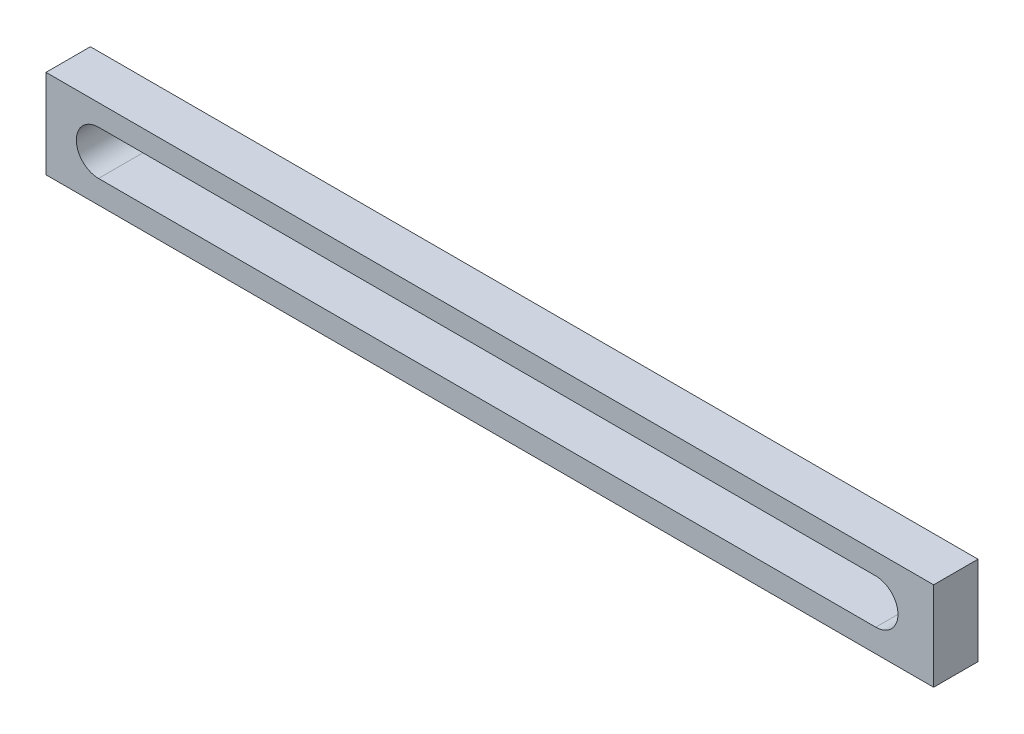
ISO-10303-21;
HEADER;
FILE_DESCRIPTION(('STEP AP214'),'2;1');
FILE_NAME('part.step','',(''),(''),'','','');
FILE_SCHEMA(('AUTOMOTIVE_DESIGN { 1 0 10303 214 1 1 1 1 }'));
ENDSEC;
DATA;
#1=APPLICATION_CONTEXT('core data for automotive mechanical design processes');
#2=APPLICATION_PROTOCOL_DEFINITION('international standard','automotive_design',2000,#1);
#3=PRODUCT_CONTEXT('',#1,'mechanical');
#4=PRODUCT('Part','Part','',(#3));
#5=PRODUCT_RELATED_PRODUCT_CATEGORY('part','',(#4));
#6=PRODUCT_DEFINITION_FORMATION('','',#4);
#7=PRODUCT_DEFINITION_CONTEXT('part definition',#1,'design');
#8=PRODUCT_DEFINITION('design','',#6,#7);
#9=PRODUCT_DEFINITION_SHAPE('','',#8);
#10=(LENGTH_UNIT() NAMED_UNIT(*) SI_UNIT(.MILLI.,.METRE.));
#11=(NAMED_UNIT(*) PLANE_ANGLE_UNIT() SI_UNIT($,.RADIAN.));
#12=(NAMED_UNIT(*) SI_UNIT($,.STERADIAN.) SOLID_ANGLE_UNIT());
#13=UNCERTAINTY_MEASURE_WITH_UNIT(LENGTH_MEASURE(1.E-05),#10,'distance_accuracy_value','');
#14=(GEOMETRIC_REPRESENTATION_CONTEXT(3) GLOBAL_UNCERTAINTY_ASSIGNED_CONTEXT((#13)) GLOBAL_UNIT_ASSIGNED_CONTEXT((#10,
#11,#12)) REPRESENTATION_CONTEXT('',''));
#15=CARTESIAN_POINT('',(0.,0.,0.));
#16=DIRECTION('',(0.,0.,1.));
#17=DIRECTION('',(1.,0.,0.));
#18=AXIS2_PLACEMENT_3D('',#15,#16,#17);
#19=CARTESIAN_POINT('',(0.,0.,5.));
#20=DIRECTION('',(0.,0.,1.));
#21=DIRECTION('',(1.,0.,0.));
#22=AXIS2_PLACEMENT_3D('',#19,#20,#21);
#23=PLANE('',#22);
#24=DIRECTION('',(0.,-1.,0.));
#25=VECTOR('',#24,1.);
#26=CARTESIAN_POINT('',(0.,0.,5.));
#27=LINE('',#26,#25);
#28=CARTESIAN_POINT('',(0.,0.,5.));
#29=VERTEX_POINT('',#28);
#30=CARTESIAN_POINT('',(0.,-10.,5.));
#31=VERTEX_POINT('',#30);
#32=EDGE_CURVE('E153',#29,#31,#27,.T.);
#33=ORIENTED_EDGE('',*,*,#32,.T.);
#34=DIRECTION('',(1.,0.,0.));
#35=VECTOR('',#34,1.);
#36=CARTESIAN_POINT('',(0.,-10.,5.));
#37=LINE('',#36,#35);
#38=CARTESIAN_POINT('',(100.,-10.,5.));
#39=VERTEX_POINT('',#38);
#40=EDGE_CURVE('E157',#31,#39,#37,.T.);
#41=ORIENTED_EDGE('',*,*,#40,.T.);
#42=DIRECTION('',(0.,1.,0.));
#43=VECTOR('',#42,1.);
#44=CARTESIAN_POINT('',(100.,0.,5.));
#45=LINE('',#44,#43);
#46=CARTESIAN_POINT('',(100.,0.,5.));
#47=VERTEX_POINT('',#46);
#48=EDGE_CURVE('E161',#39,#47,#45,.T.);
#49=ORIENTED_EDGE('',*,*,#48,.T.);
#50=DIRECTION('',(-1.,0.,0.));
#51=VECTOR('',#50,1.);
#52=CARTESIAN_POINT('',(0.,0.,5.));
#53=LINE('',#52,#51);
#54=EDGE_CURVE('E164',#47,#29,#53,.T.);
#55=ORIENTED_EDGE('',*,*,#54,.T.);
#56=EDGE_LOOP('',(#33,#41,#49,#55));
#57=FACE_BOUND('',#56,.T.);
#58=DIRECTION('',(1.,0.,0.));
#59=VECTOR('',#58,1.);
#60=CARTESIAN_POINT('',(5.91642862096152,-7.39368573634082,5.));
#61=LINE('',#60,#59);
#62=CARTESIAN_POINT('',(5.91642862096152,-7.39368573634082,5.));
#63=VERTEX_POINT('',#62);
#64=CARTESIAN_POINT('',(93.4819502460819,-7.39368573634081,5.));
#65=VERTEX_POINT('',#64);
#66=EDGE_CURVE('E114',#63,#65,#61,.T.);
#67=ORIENTED_EDGE('',*,*,#66,.F.);
#68=CARTESIAN_POINT('',(5.91642862096152,-4.89368573634082,5.));
#69=DIRECTION('',(0.,0.,1.));
#70=DIRECTION('',(1.,0.,0.));
#71=AXIS2_PLACEMENT_3D('',#68,#69,#70);
#72=CIRCLE('',#71,2.5);
#73=CARTESIAN_POINT('',(5.91642862096152,-2.39368573634082,5.));
#74=VERTEX_POINT('',#73);
#75=EDGE_CURVE('E105',#74,#63,#72,.T.);
#76=ORIENTED_EDGE('',*,*,#75,.F.);
#77=DIRECTION('',(-1.,0.,0.));
#78=VECTOR('',#77,1.);
#79=CARTESIAN_POINT('',(5.91642862096152,-2.39368573634082,5.));
#80=LINE('',#79,#78);
#81=CARTESIAN_POINT('',(93.4819502460819,-2.39368573634082,5.));
#82=VERTEX_POINT('',#81);
#83=EDGE_CURVE('E131',#82,#74,#80,.T.);
#84=ORIENTED_EDGE('',*,*,#83,.F.);
#85=CARTESIAN_POINT('',(93.4819502460819,-4.89368573634082,5.));
#86=DIRECTION('',(0.,0.,1.));
#87=DIRECTION('',(1.,0.,0.));
#88=AXIS2_PLACEMENT_3D('',#85,#86,#87);
#89=CIRCLE('',#88,2.5);
#90=EDGE_CURVE('E127',#65,#82,#89,.T.);
#91=ORIENTED_EDGE('',*,*,#90,.F.);
#92=EDGE_LOOP('',(#67,#76,#84,#91));
#93=FACE_BOUND('',#92,.T.);
#94=ADVANCED_FACE('F39',(#57,#93),#23,.T.);
#95=CARTESIAN_POINT('',(0.,0.,0.));
#96=DIRECTION('',(0.,0.,1.));
#97=DIRECTION('',(1.,0.,0.));
#98=AXIS2_PLACEMENT_3D('',#95,#96,#97);
#99=PLANE('',#98);
#100=DIRECTION('',(0.,-1.,0.));
#101=VECTOR('',#100,1.);
#102=CARTESIAN_POINT('',(0.,0.,0.));
#103=LINE('',#102,#101);
#104=CARTESIAN_POINT('',(0.,0.,0.));
#105=VERTEX_POINT('',#104);
#106=CARTESIAN_POINT('',(0.,-10.,0.));
#107=VERTEX_POINT('',#106);
#108=EDGE_CURVE('E123',#105,#107,#103,.T.);
#109=ORIENTED_EDGE('',*,*,#108,.F.);
#110=DIRECTION('',(-1.,0.,0.));
#111=VECTOR('',#110,1.);
#112=CARTESIAN_POINT('',(0.,0.,0.));
#113=LINE('',#112,#111);
#114=CARTESIAN_POINT('',(100.,0.,0.));
#115=VERTEX_POINT('',#114);
#116=EDGE_CURVE('E158',#115,#105,#113,.T.);
#117=ORIENTED_EDGE('',*,*,#116,.F.);
#118=DIRECTION('',(0.,1.,0.));
#119=VECTOR('',#118,1.);
#120=CARTESIAN_POINT('',(100.,0.,0.));
#121=LINE('',#120,#119);
#122=CARTESIAN_POINT('',(100.,-10.,0.));
#123=VERTEX_POINT('',#122);
#124=EDGE_CURVE('E174',#123,#115,#121,.T.);
#125=ORIENTED_EDGE('',*,*,#124,.F.);
#126=DIRECTION('',(1.,0.,0.));
#127=VECTOR('',#126,1.);
#128=CARTESIAN_POINT('',(0.,-10.,0.));
#129=LINE('',#128,#127);
#130=EDGE_CURVE('E171',#107,#123,#129,.T.);
#131=ORIENTED_EDGE('',*,*,#130,.F.);
#132=EDGE_LOOP('',(#109,#117,#125,#131));
#133=FACE_BOUND('',#132,.T.);
#134=CARTESIAN_POINT('',(5.91642862096152,-4.89368573634082,0.));
#135=DIRECTION('',(0.,0.,1.));
#136=DIRECTION('',(1.,0.,0.));
#137=AXIS2_PLACEMENT_3D('',#134,#135,#136);
#138=CIRCLE('',#137,2.5);
#139=CARTESIAN_POINT('',(5.91642862096152,-2.39368573634082,0.));
#140=VERTEX_POINT('',#139);
#141=CARTESIAN_POINT('',(5.91642862096152,-7.39368573634082,0.));
#142=VERTEX_POINT('',#141);
#143=EDGE_CURVE('E63',#140,#142,#138,.T.);
#144=ORIENTED_EDGE('',*,*,#143,.T.);
#145=DIRECTION('',(1.,0.,0.));
#146=VECTOR('',#145,1.);
#147=CARTESIAN_POINT('',(5.91642862096152,-7.39368573634082,0.));
#148=LINE('',#147,#146);
#149=CARTESIAN_POINT('',(93.4819502460819,-7.39368573634081,0.));
#150=VERTEX_POINT('',#149);
#151=EDGE_CURVE('E121',#142,#150,#148,.T.);
#152=ORIENTED_EDGE('',*,*,#151,.T.);
#153=CARTESIAN_POINT('',(93.4819502460819,-4.89368573634082,0.));
#154=DIRECTION('',(0.,0.,1.));
#155=DIRECTION('',(1.,0.,0.));
#156=AXIS2_PLACEMENT_3D('',#153,#154,#155);
#157=CIRCLE('',#156,2.5);
#158=CARTESIAN_POINT('',(93.4819502460819,-2.39368573634082,0.));
#159=VERTEX_POINT('',#158);
#160=EDGE_CURVE('E140',#150,#159,#157,.T.);
#161=ORIENTED_EDGE('',*,*,#160,.T.);
#162=DIRECTION('',(-1.,0.,0.));
#163=VECTOR('',#162,1.);
#164=CARTESIAN_POINT('',(5.91642862096152,-2.39368573634082,0.));
#165=LINE('',#164,#163);
#166=EDGE_CURVE('E115',#159,#140,#165,.T.);
#167=ORIENTED_EDGE('',*,*,#166,.T.);
#168=EDGE_LOOP('',(#144,#152,#161,#167));
#169=FACE_BOUND('',#168,.T.);
#170=ADVANCED_FACE('F197',(#133,#169),#99,.F.);
#171=CARTESIAN_POINT('',(0.,0.,5.));
#172=DIRECTION('',(1.,0.,0.));
#173=DIRECTION('',(0.,1.,0.));
#174=AXIS2_PLACEMENT_3D('',#171,#172,#173);
#175=PLANE('',#174);
#176=ORIENTED_EDGE('',*,*,#108,.T.);
#177=DIRECTION('',(0.,0.,-1.));
#178=VECTOR('',#177,1.);
#179=CARTESIAN_POINT('',(0.,-10.,5.));
#180=LINE('',#179,#178);
#181=EDGE_CURVE('E11',#31,#107,#180,.T.);
#182=ORIENTED_EDGE('',*,*,#181,.F.);
#183=ORIENTED_EDGE('',*,*,#32,.F.);
#184=DIRECTION('',(0.,0.,-1.));
#185=VECTOR('',#184,1.);
#186=CARTESIAN_POINT('',(0.,0.,5.));
#187=LINE('',#186,#185);
#188=EDGE_CURVE('E167',#29,#105,#187,.T.);
#189=ORIENTED_EDGE('',*,*,#188,.T.);
#190=EDGE_LOOP('',(#176,#182,#183,#189));
#191=FACE_BOUND('',#190,.T.);
#192=ADVANCED_FACE('F41',(#191),#175,.F.);
#193=CARTESIAN_POINT('',(0.,-10.,5.));
#194=DIRECTION('',(0.,1.,0.));
#195=DIRECTION('',(0.,0.,1.));
#196=AXIS2_PLACEMENT_3D('',#193,#194,#195);
#197=PLANE('',#196);
#198=ORIENTED_EDGE('',*,*,#130,.T.);
#199=DIRECTION('',(0.,0.,-1.));
#200=VECTOR('',#199,1.);
#201=CARTESIAN_POINT('',(100.,-10.,5.));
#202=LINE('',#201,#200);
#203=EDGE_CURVE('E48',#39,#123,#202,.T.);
#204=ORIENTED_EDGE('',*,*,#203,.F.);
#205=ORIENTED_EDGE('',*,*,#40,.F.);
#206=ORIENTED_EDGE('',*,*,#181,.T.);
#207=EDGE_LOOP('',(#198,#204,#205,#206));
#208=FACE_BOUND('',#207,.T.);
#209=ADVANCED_FACE('F207',(#208),#197,.F.);
#210=CARTESIAN_POINT('',(100.,0.,5.));
#211=DIRECTION('',(-1.,0.,0.));
#212=DIRECTION('',(0.,0.,1.));
#213=AXIS2_PLACEMENT_3D('',#210,#211,#212);
#214=PLANE('',#213);
#215=ORIENTED_EDGE('',*,*,#124,.T.);
#216=DIRECTION('',(0.,0.,-1.));
#217=VECTOR('',#216,1.);
#218=CARTESIAN_POINT('',(100.,0.,5.));
#219=LINE('',#218,#217);
#220=EDGE_CURVE('E182',#47,#115,#219,.T.);
#221=ORIENTED_EDGE('',*,*,#220,.F.);
#222=ORIENTED_EDGE('',*,*,#48,.F.);
#223=ORIENTED_EDGE('',*,*,#203,.T.);
#224=EDGE_LOOP('',(#215,#221,#222,#223));
#225=FACE_BOUND('',#224,.T.);
#226=ADVANCED_FACE('F191',(#225),#214,.F.);
#227=CARTESIAN_POINT('',(0.,0.,5.));
#228=DIRECTION('',(0.,-1.,0.));
#229=DIRECTION('',(0.,0.,-1.));
#230=AXIS2_PLACEMENT_3D('',#227,#228,#229);
#231=PLANE('',#230);
#232=ORIENTED_EDGE('',*,*,#116,.T.);
#233=ORIENTED_EDGE('',*,*,#188,.F.);
#234=ORIENTED_EDGE('',*,*,#54,.F.);
#235=ORIENTED_EDGE('',*,*,#220,.T.);
#236=EDGE_LOOP('',(#232,#233,#234,#235));
#237=FACE_BOUND('',#236,.T.);
#238=ADVANCED_FACE('F201',(#237),#231,.F.);
#239=CARTESIAN_POINT('',(5.91642862096152,-4.89368573634082,5.));
#240=DIRECTION('',(0.,0.,-1.));
#241=DIRECTION('',(-1.,0.,0.));
#242=AXIS2_PLACEMENT_3D('',#239,#240,#241);
#243=CYLINDRICAL_SURFACE('',#242,2.5);
#244=ORIENTED_EDGE('',*,*,#143,.F.);
#245=DIRECTION('',(0.,0.,-1.));
#246=VECTOR('',#245,1.);
#247=CARTESIAN_POINT('',(5.91642862096152,-2.39368573634082,5.));
#248=LINE('',#247,#246);
#249=EDGE_CURVE('E109',#74,#140,#248,.T.);
#250=ORIENTED_EDGE('',*,*,#249,.F.);
#251=ORIENTED_EDGE('',*,*,#75,.T.);
#252=DIRECTION('',(0.,0.,-1.));
#253=VECTOR('',#252,1.);
#254=CARTESIAN_POINT('',(5.91642862096152,-7.39368573634082,5.));
#255=LINE('',#254,#253);
#256=EDGE_CURVE('E108',#63,#142,#255,.T.);
#257=ORIENTED_EDGE('',*,*,#256,.T.);
#258=EDGE_LOOP('',(#244,#250,#251,#257));
#259=FACE_BOUND('',#258,.T.);
#260=ADVANCED_FACE('F107',(#259),#243,.F.);
#261=CARTESIAN_POINT('',(5.91642862096152,-7.39368573634082,5.));
#262=DIRECTION('',(0.,1.,0.));
#263=DIRECTION('',(-1.,0.,0.));
#264=AXIS2_PLACEMENT_3D('',#261,#262,#263);
#265=PLANE('',#264);
#266=ORIENTED_EDGE('',*,*,#151,.F.);
#267=ORIENTED_EDGE('',*,*,#256,.F.);
#268=ORIENTED_EDGE('',*,*,#66,.T.);
#269=DIRECTION('',(0.,0.,-1.));
#270=VECTOR('',#269,1.);
#271=CARTESIAN_POINT('',(93.4819502460819,-7.39368573634081,5.));
#272=LINE('',#271,#270);
#273=EDGE_CURVE('E124',#65,#150,#272,.T.);
#274=ORIENTED_EDGE('',*,*,#273,.T.);
#275=EDGE_LOOP('',(#266,#267,#268,#274));
#276=FACE_BOUND('',#275,.T.);
#277=ADVANCED_FACE('F118',(#276),#265,.T.);
#278=CARTESIAN_POINT('',(93.4819502460819,-4.89368573634082,5.));
#279=DIRECTION('',(0.,0.,-1.));
#280=DIRECTION('',(-1.,0.,0.));
#281=AXIS2_PLACEMENT_3D('',#278,#279,#280);
#282=CYLINDRICAL_SURFACE('',#281,2.5);
#283=ORIENTED_EDGE('',*,*,#160,.F.);
#284=ORIENTED_EDGE('',*,*,#273,.F.);
#285=ORIENTED_EDGE('',*,*,#90,.T.);
#286=DIRECTION('',(0.,0.,-1.));
#287=VECTOR('',#286,1.);
#288=CARTESIAN_POINT('',(93.4819502460819,-2.39368573634082,5.));
#289=LINE('',#288,#287);
#290=EDGE_CURVE('E55',#82,#159,#289,.T.);
#291=ORIENTED_EDGE('',*,*,#290,.T.);
#292=EDGE_LOOP('',(#283,#284,#285,#291));
#293=FACE_BOUND('',#292,.T.);
#294=ADVANCED_FACE('F230',(#293),#282,.F.);
#295=CARTESIAN_POINT('',(5.91642862096152,-2.39368573634082,5.));
#296=DIRECTION('',(0.,-1.,0.));
#297=DIRECTION('',(1.,0.,0.));
#298=AXIS2_PLACEMENT_3D('',#295,#296,#297);
#299=PLANE('',#298);
#300=ORIENTED_EDGE('',*,*,#166,.F.);
#301=ORIENTED_EDGE('',*,*,#290,.F.);
#302=ORIENTED_EDGE('',*,*,#83,.T.);
#303=ORIENTED_EDGE('',*,*,#249,.T.);
#304=EDGE_LOOP('',(#300,#301,#302,#303));
#305=FACE_BOUND('',#304,.T.);
#306=ADVANCED_FACE('F234',(#305),#299,.T.);
#307=CLOSED_SHELL('',(#94,#170,#192,#209,#226,#238,#260,#277,#294,#306));
#308=MANIFOLD_SOLID_BREP('B2',#307);
#309=ADVANCED_BREP_SHAPE_REPRESENTATION('',(#18,#308),#14);
#310=SHAPE_DEFINITION_REPRESENTATION(#9,#309);
ENDSEC;
END-ISO-10303-21;
